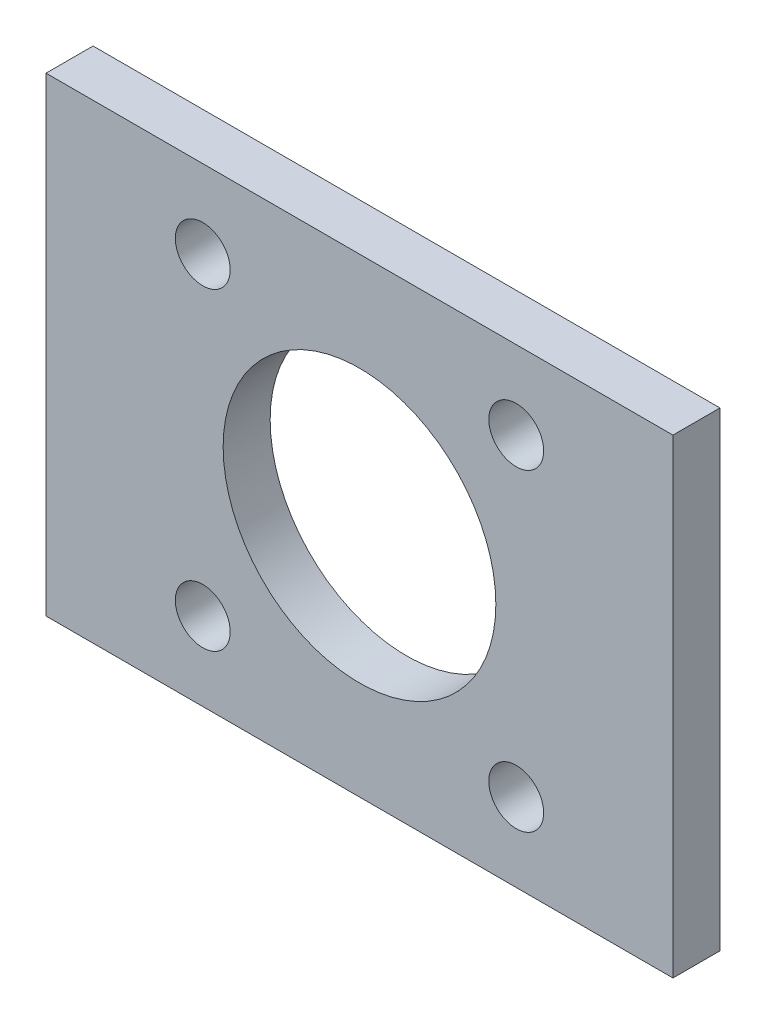
ISO-10303-21;
HEADER;
FILE_DESCRIPTION(('STEP AP214'),'2;1');
FILE_NAME('part.step','',(''),(''),'','','');
FILE_SCHEMA(('AUTOMOTIVE_DESIGN { 1 0 10303 214 1 1 1 1 }'));
ENDSEC;
DATA;
#1=APPLICATION_CONTEXT('core data for automotive mechanical design processes');
#2=APPLICATION_PROTOCOL_DEFINITION('international standard','automotive_design',2000,#1);
#3=PRODUCT_CONTEXT('',#1,'mechanical');
#4=PRODUCT('Part','Part','',(#3));
#5=PRODUCT_RELATED_PRODUCT_CATEGORY('part','',(#4));
#6=PRODUCT_DEFINITION_FORMATION('','',#4);
#7=PRODUCT_DEFINITION_CONTEXT('part definition',#1,'design');
#8=PRODUCT_DEFINITION('design','',#6,#7);
#9=PRODUCT_DEFINITION_SHAPE('','',#8);
#10=(LENGTH_UNIT() NAMED_UNIT(*) SI_UNIT(.MILLI.,.METRE.));
#11=(NAMED_UNIT(*) PLANE_ANGLE_UNIT() SI_UNIT($,.RADIAN.));
#12=(NAMED_UNIT(*) SI_UNIT($,.STERADIAN.) SOLID_ANGLE_UNIT());
#13=UNCERTAINTY_MEASURE_WITH_UNIT(LENGTH_MEASURE(1.E-05),#10,'distance_accuracy_value','');
#14=(GEOMETRIC_REPRESENTATION_CONTEXT(3) GLOBAL_UNCERTAINTY_ASSIGNED_CONTEXT((#13)) GLOBAL_UNIT_ASSIGNED_CONTEXT((#10,
#11,#12)) REPRESENTATION_CONTEXT('',''));
#15=CARTESIAN_POINT('',(0.,0.,0.));
#16=DIRECTION('',(0.,0.,1.));
#17=DIRECTION('',(1.,0.,0.));
#18=AXIS2_PLACEMENT_3D('',#15,#16,#17);
#19=CARTESIAN_POINT('',(46.5399833355393,-4.45065110459608,15.7508262269223));
#20=DIRECTION('',(0.,0.,1.));
#21=DIRECTION('',(1.,0.,0.));
#22=AXIS2_PLACEMENT_3D('',#19,#20,#21);
#23=PLANE('',#22);
#24=DIRECTION('',(0.,-1.,0.));
#25=VECTOR('',#24,1.);
#26=CARTESIAN_POINT('',(26.5399833355393,-14.4506511045961,15.7508262269223));
#27=LINE('',#26,#25);
#28=CARTESIAN_POINT('',(26.5399833355393,10.5493488954039,15.7508262269223));
#29=VERTEX_POINT('',#28);
#30=CARTESIAN_POINT('',(26.5399833355393,-19.4506511045961,15.7508262269223));
#31=VERTEX_POINT('',#30);
#32=EDGE_CURVE('E75',#29,#31,#27,.T.);
#33=ORIENTED_EDGE('',*,*,#32,.T.);
#34=DIRECTION('',(1.,0.,0.));
#35=VECTOR('',#34,1.);
#36=CARTESIAN_POINT('',(16.5399833355393,-19.4506511045961,15.7508262269223));
#37=LINE('',#36,#35);
#38=CARTESIAN_POINT('',(66.5399833355393,-19.4506511045961,15.7508262269223));
#39=VERTEX_POINT('',#38);
#40=EDGE_CURVE('E79',#31,#39,#37,.T.);
#41=ORIENTED_EDGE('',*,*,#40,.T.);
#42=DIRECTION('',(0.,1.,0.));
#43=VECTOR('',#42,1.);
#44=CARTESIAN_POINT('',(66.5399833355393,10.5493488954039,15.7508262269223));
#45=LINE('',#44,#43);
#46=CARTESIAN_POINT('',(66.5399833355393,10.5493488954039,15.7508262269223));
#47=VERTEX_POINT('',#46);
#48=EDGE_CURVE('E93',#39,#47,#45,.T.);
#49=ORIENTED_EDGE('',*,*,#48,.T.);
#50=DIRECTION('',(-1.,0.,0.));
#51=VECTOR('',#50,1.);
#52=CARTESIAN_POINT('',(26.5399833355393,10.5493488954039,15.7508262269223));
#53=LINE('',#52,#51);
#54=EDGE_CURVE('E58',#47,#29,#53,.T.);
#55=ORIENTED_EDGE('',*,*,#54,.T.);
#56=EDGE_LOOP('',(#33,#41,#49,#55));
#57=FACE_BOUND('',#56,.T.);
#58=CARTESIAN_POINT('',(36.5399833355393,-14.4506511045961,15.7508262269223));
#59=DIRECTION('',(0.,0.,1.));
#60=DIRECTION('',(1.,0.,0.));
#61=AXIS2_PLACEMENT_3D('',#58,#59,#60);
#62=CIRCLE('',#61,1.75);
#63=CARTESIAN_POINT('',(38.2899833355393,-14.4506511045961,15.7508262269223));
#64=VERTEX_POINT('',#63);
#65=EDGE_CURVE('E135',#64,#64,#62,.T.);
#66=ORIENTED_EDGE('',*,*,#65,.F.);
#67=EDGE_LOOP('',(#66));
#68=FACE_BOUND('',#67,.T.);
#69=CARTESIAN_POINT('',(56.5399833355393,5.54934889540392,15.7508262269223));
#70=DIRECTION('',(0.,0.,1.));
#71=DIRECTION('',(1.,0.,0.));
#72=AXIS2_PLACEMENT_3D('',#69,#70,#71);
#73=CIRCLE('',#72,1.75);
#74=CARTESIAN_POINT('',(58.2899833355393,5.54934889540392,15.7508262269223));
#75=VERTEX_POINT('',#74);
#76=EDGE_CURVE('E94',#75,#75,#73,.T.);
#77=ORIENTED_EDGE('',*,*,#76,.F.);
#78=EDGE_LOOP('',(#77));
#79=FACE_BOUND('',#78,.T.);
#80=CARTESIAN_POINT('',(36.5399833355393,5.54934889540389,15.7508262269223));
#81=DIRECTION('',(0.,0.,1.));
#82=DIRECTION('',(1.,0.,0.));
#83=AXIS2_PLACEMENT_3D('',#80,#81,#82);
#84=CIRCLE('',#83,1.74999999999999);
#85=CARTESIAN_POINT('',(38.2899833355393,5.54934889540389,15.7508262269223));
#86=VERTEX_POINT('',#85);
#87=EDGE_CURVE('E98',#86,#86,#84,.T.);
#88=ORIENTED_EDGE('',*,*,#87,.F.);
#89=EDGE_LOOP('',(#88));
#90=FACE_BOUND('',#89,.T.);
#91=CARTESIAN_POINT('',(56.5399833355393,-14.4506511045961,15.7508262269223));
#92=DIRECTION('',(0.,0.,1.));
#93=DIRECTION('',(1.,0.,0.));
#94=AXIS2_PLACEMENT_3D('',#91,#92,#93);
#95=CIRCLE('',#94,1.75);
#96=CARTESIAN_POINT('',(58.2899833355393,-14.4506511045961,15.7508262269223));
#97=VERTEX_POINT('',#96);
#98=EDGE_CURVE('E132',#97,#97,#95,.T.);
#99=ORIENTED_EDGE('',*,*,#98,.F.);
#100=EDGE_LOOP('',(#99));
#101=FACE_BOUND('',#100,.T.);
#102=CARTESIAN_POINT('',(46.5399833355393,-4.45065110459608,15.7508262269223));
#103=DIRECTION('',(0.,0.,1.));
#104=DIRECTION('',(1.,0.,0.));
#105=AXIS2_PLACEMENT_3D('',#102,#103,#104);
#106=CIRCLE('',#105,8.7);
#107=CARTESIAN_POINT('',(55.2399833355393,-4.45065110459608,15.7508262269223));
#108=VERTEX_POINT('',#107);
#109=EDGE_CURVE('E126',#108,#108,#106,.T.);
#110=ORIENTED_EDGE('',*,*,#109,.F.);
#111=EDGE_LOOP('',(#110));
#112=FACE_BOUND('',#111,.T.);
#113=ADVANCED_FACE('F35',(#57,#68,#79,#90,#101,#112),#23,.T.);
#114=CARTESIAN_POINT('',(16.5399833355393,-19.4506511045961,15.7508262269223));
#115=DIRECTION('',(0.,1.,0.));
#116=DIRECTION('',(0.,0.,1.));
#117=AXIS2_PLACEMENT_3D('',#114,#115,#116);
#118=PLANE('',#117);
#119=ORIENTED_EDGE('',*,*,#40,.F.);
#120=DIRECTION('',(0.,0.,-1.));
#121=VECTOR('',#120,1.);
#122=CARTESIAN_POINT('',(26.5399833355393,-19.4506511045961,15.7508262269223));
#123=LINE('',#122,#121);
#124=CARTESIAN_POINT('',(26.5399833355393,-19.4506511045961,12.7508262269223));
#125=VERTEX_POINT('',#124);
#126=EDGE_CURVE('E85',#31,#125,#123,.T.);
#127=ORIENTED_EDGE('',*,*,#126,.T.);
#128=DIRECTION('',(-1.,0.,0.));
#129=VECTOR('',#128,1.);
#130=CARTESIAN_POINT('',(76.5399833355393,-19.4506511045961,12.7508262269223));
#131=LINE('',#130,#129);
#132=CARTESIAN_POINT('',(66.5399833355393,-19.4506511045961,12.7508262269223));
#133=VERTEX_POINT('',#132);
#134=EDGE_CURVE('E108',#133,#125,#131,.T.);
#135=ORIENTED_EDGE('',*,*,#134,.F.);
#136=DIRECTION('',(0.,0.,-1.));
#137=VECTOR('',#136,1.);
#138=CARTESIAN_POINT('',(66.5399833355393,-19.4506511045961,15.7508262269223));
#139=LINE('',#138,#137);
#140=EDGE_CURVE('E90',#39,#133,#139,.T.);
#141=ORIENTED_EDGE('',*,*,#140,.F.);
#142=EDGE_LOOP('',(#119,#127,#135,#141));
#143=FACE_BOUND('',#142,.T.);
#144=ADVANCED_FACE('F37',(#143),#118,.F.);
#145=CARTESIAN_POINT('',(66.5399833355393,10.5493488954039,15.7508262269223));
#146=DIRECTION('',(-1.,0.,0.));
#147=DIRECTION('',(0.,-1.,0.));
#148=AXIS2_PLACEMENT_3D('',#145,#146,#147);
#149=PLANE('',#148);
#150=ORIENTED_EDGE('',*,*,#48,.F.);
#151=ORIENTED_EDGE('',*,*,#140,.T.);
#152=DIRECTION('',(0.,1.,0.));
#153=VECTOR('',#152,1.);
#154=CARTESIAN_POINT('',(66.5399833355393,10.5493488954039,12.7508262269223));
#155=LINE('',#154,#153);
#156=CARTESIAN_POINT('',(66.5399833355393,10.5493488954039,12.7508262269223));
#157=VERTEX_POINT('',#156);
#158=EDGE_CURVE('E50',#133,#157,#155,.T.);
#159=ORIENTED_EDGE('',*,*,#158,.T.);
#160=DIRECTION('',(0.,0.,-1.));
#161=VECTOR('',#160,1.);
#162=CARTESIAN_POINT('',(66.5399833355393,10.5493488954039,15.7508262269223));
#163=LINE('',#162,#161);
#164=EDGE_CURVE('E12',#47,#157,#163,.T.);
#165=ORIENTED_EDGE('',*,*,#164,.F.);
#166=EDGE_LOOP('',(#150,#151,#159,#165));
#167=FACE_BOUND('',#166,.T.);
#168=ADVANCED_FACE('F178',(#167),#149,.F.);
#169=CARTESIAN_POINT('',(26.5399833355393,10.5493488954039,15.7508262269223));
#170=DIRECTION('',(0.,-1.,0.));
#171=DIRECTION('',(1.,0.,0.));
#172=AXIS2_PLACEMENT_3D('',#169,#170,#171);
#173=PLANE('',#172);
#174=ORIENTED_EDGE('',*,*,#164,.T.);
#175=DIRECTION('',(1.,0.,0.));
#176=VECTOR('',#175,1.);
#177=CARTESIAN_POINT('',(76.5399833355393,10.5493488954039,12.7508262269223));
#178=LINE('',#177,#176);
#179=CARTESIAN_POINT('',(26.5399833355393,10.5493488954039,12.7508262269223));
#180=VERTEX_POINT('',#179);
#181=EDGE_CURVE('E105',#180,#157,#178,.T.);
#182=ORIENTED_EDGE('',*,*,#181,.F.);
#183=DIRECTION('',(0.,0.,-1.));
#184=VECTOR('',#183,1.);
#185=CARTESIAN_POINT('',(26.5399833355393,10.5493488954039,15.7508262269223));
#186=LINE('',#185,#184);
#187=EDGE_CURVE('E43',#29,#180,#186,.T.);
#188=ORIENTED_EDGE('',*,*,#187,.F.);
#189=ORIENTED_EDGE('',*,*,#54,.F.);
#190=EDGE_LOOP('',(#174,#182,#188,#189));
#191=FACE_BOUND('',#190,.T.);
#192=ADVANCED_FACE('F104',(#191),#173,.F.);
#193=CARTESIAN_POINT('',(26.5399833355393,-14.4506511045961,15.7508262269223));
#194=DIRECTION('',(1.,0.,0.));
#195=DIRECTION('',(0.,1.,0.));
#196=AXIS2_PLACEMENT_3D('',#193,#194,#195);
#197=PLANE('',#196);
#198=ORIENTED_EDGE('',*,*,#187,.T.);
#199=DIRECTION('',(0.,-1.,0.));
#200=VECTOR('',#199,1.);
#201=CARTESIAN_POINT('',(26.5399833355393,-14.4506511045961,12.7508262269223));
#202=LINE('',#201,#200);
#203=EDGE_CURVE('E87',#180,#125,#202,.T.);
#204=ORIENTED_EDGE('',*,*,#203,.T.);
#205=ORIENTED_EDGE('',*,*,#126,.F.);
#206=ORIENTED_EDGE('',*,*,#32,.F.);
#207=EDGE_LOOP('',(#198,#204,#205,#206));
#208=FACE_BOUND('',#207,.T.);
#209=ADVANCED_FACE('F86',(#208),#197,.F.);
#210=CARTESIAN_POINT('',(56.5399833355393,5.54934889540392,15.7508262269223));
#211=DIRECTION('',(0.,0.,-1.));
#212=DIRECTION('',(-1.,0.,0.));
#213=AXIS2_PLACEMENT_3D('',#210,#211,#212);
#214=CYLINDRICAL_SURFACE('',#213,1.75);
#215=CARTESIAN_POINT('',(56.5399833355393,5.54934889540392,12.7508262269223));
#216=DIRECTION('',(0.,0.,1.));
#217=DIRECTION('',(1.,0.,0.));
#218=AXIS2_PLACEMENT_3D('',#215,#216,#217);
#219=CIRCLE('',#218,1.75);
#220=CARTESIAN_POINT('',(58.2899833355393,5.54934889540392,12.7508262269223));
#221=VERTEX_POINT('',#220);
#222=EDGE_CURVE('E121',#221,#221,#219,.T.);
#223=ORIENTED_EDGE('',*,*,#222,.F.);
#224=EDGE_LOOP('',(#223));
#225=FACE_BOUND('',#224,.T.);
#226=ORIENTED_EDGE('',*,*,#76,.T.);
#227=EDGE_LOOP('',(#226));
#228=FACE_BOUND('',#227,.T.);
#229=ADVANCED_FACE('F170',(#225,#228),#214,.F.);
#230=CARTESIAN_POINT('',(36.5399833355393,5.54934889540389,15.7508262269223));
#231=DIRECTION('',(0.,0.,-1.));
#232=DIRECTION('',(-1.,0.,0.));
#233=AXIS2_PLACEMENT_3D('',#230,#231,#232);
#234=CYLINDRICAL_SURFACE('',#233,1.74999999999999);
#235=CARTESIAN_POINT('',(36.5399833355393,5.54934889540389,12.7508262269223));
#236=DIRECTION('',(0.,0.,1.));
#237=DIRECTION('',(1.,0.,0.));
#238=AXIS2_PLACEMENT_3D('',#235,#236,#237);
#239=CIRCLE('',#238,1.74999999999999);
#240=CARTESIAN_POINT('',(38.2899833355393,5.54934889540389,12.7508262269223));
#241=VERTEX_POINT('',#240);
#242=EDGE_CURVE('E118',#241,#241,#239,.T.);
#243=ORIENTED_EDGE('',*,*,#242,.F.);
#244=EDGE_LOOP('',(#243));
#245=FACE_BOUND('',#244,.T.);
#246=ORIENTED_EDGE('',*,*,#87,.T.);
#247=EDGE_LOOP('',(#246));
#248=FACE_BOUND('',#247,.T.);
#249=ADVANCED_FACE('F140',(#245,#248),#234,.F.);
#250=CARTESIAN_POINT('',(36.5399833355393,-14.4506511045961,15.7508262269223));
#251=DIRECTION('',(0.,0.,-1.));
#252=DIRECTION('',(-1.,0.,0.));
#253=AXIS2_PLACEMENT_3D('',#250,#251,#252);
#254=CYLINDRICAL_SURFACE('',#253,1.75);
#255=CARTESIAN_POINT('',(36.5399833355393,-14.4506511045961,12.7508262269223));
#256=DIRECTION('',(0.,0.,1.));
#257=DIRECTION('',(1.,0.,0.));
#258=AXIS2_PLACEMENT_3D('',#255,#256,#257);
#259=CIRCLE('',#258,1.75);
#260=CARTESIAN_POINT('',(38.2899833355393,-14.4506511045961,12.7508262269223));
#261=VERTEX_POINT('',#260);
#262=EDGE_CURVE('E111',#261,#261,#259,.T.);
#263=ORIENTED_EDGE('',*,*,#262,.F.);
#264=EDGE_LOOP('',(#263));
#265=FACE_BOUND('',#264,.T.);
#266=ORIENTED_EDGE('',*,*,#65,.T.);
#267=EDGE_LOOP('',(#266));
#268=FACE_BOUND('',#267,.T.);
#269=ADVANCED_FACE('F161',(#265,#268),#254,.F.);
#270=CARTESIAN_POINT('',(56.5399833355393,-14.4506511045961,15.7508262269223));
#271=DIRECTION('',(0.,0.,-1.));
#272=DIRECTION('',(-1.,0.,0.));
#273=AXIS2_PLACEMENT_3D('',#270,#271,#272);
#274=CYLINDRICAL_SURFACE('',#273,1.75);
#275=CARTESIAN_POINT('',(56.5399833355393,-14.4506511045961,12.7508262269223));
#276=DIRECTION('',(0.,0.,1.));
#277=DIRECTION('',(1.,0.,0.));
#278=AXIS2_PLACEMENT_3D('',#275,#276,#277);
#279=CIRCLE('',#278,1.75);
#280=CARTESIAN_POINT('',(58.2899833355393,-14.4506511045961,12.7508262269223));
#281=VERTEX_POINT('',#280);
#282=EDGE_CURVE('E107',#281,#281,#279,.T.);
#283=ORIENTED_EDGE('',*,*,#282,.F.);
#284=EDGE_LOOP('',(#283));
#285=FACE_BOUND('',#284,.T.);
#286=ORIENTED_EDGE('',*,*,#98,.T.);
#287=EDGE_LOOP('',(#286));
#288=FACE_BOUND('',#287,.T.);
#289=ADVANCED_FACE('F152',(#285,#288),#274,.F.);
#290=CARTESIAN_POINT('',(46.5399833355393,-4.45065110459608,-21.6849168831158));
#291=DIRECTION('',(0.,0.,1.));
#292=DIRECTION('',(1.,0.,0.));
#293=AXIS2_PLACEMENT_3D('',#290,#291,#292);
#294=CYLINDRICAL_SURFACE('',#293,8.7);
#295=CARTESIAN_POINT('',(46.5399833355393,-4.45065110459608,12.7508262269223));
#296=DIRECTION('',(0.,0.,1.));
#297=DIRECTION('',(1.,0.,0.));
#298=AXIS2_PLACEMENT_3D('',#295,#296,#297);
#299=CIRCLE('',#298,8.7);
#300=CARTESIAN_POINT('',(55.2399833355393,-4.45065110459608,12.7508262269223));
#301=VERTEX_POINT('',#300);
#302=EDGE_CURVE('E129',#301,#301,#299,.F.);
#303=ORIENTED_EDGE('',*,*,#302,.T.);
#304=EDGE_LOOP('',(#303));
#305=FACE_BOUND('',#304,.T.);
#306=ORIENTED_EDGE('',*,*,#109,.T.);
#307=EDGE_LOOP('',(#306));
#308=FACE_BOUND('',#307,.T.);
#309=ADVANCED_FACE('F149',(#305,#308),#294,.F.);
#310=CARTESIAN_POINT('',(46.5399833355393,-4.45065110459608,12.7508262269223));
#311=DIRECTION('',(0.,0.,1.));
#312=DIRECTION('',(1.,0.,0.));
#313=AXIS2_PLACEMENT_3D('',#310,#311,#312);
#314=PLANE('',#313);
#315=ORIENTED_EDGE('',*,*,#302,.F.);
#316=EDGE_LOOP('',(#315));
#317=FACE_BOUND('',#316,.T.);
#318=ORIENTED_EDGE('',*,*,#222,.T.);
#319=EDGE_LOOP('',(#318));
#320=FACE_BOUND('',#319,.T.);
#321=ORIENTED_EDGE('',*,*,#242,.T.);
#322=EDGE_LOOP('',(#321));
#323=FACE_BOUND('',#322,.T.);
#324=ORIENTED_EDGE('',*,*,#262,.T.);
#325=EDGE_LOOP('',(#324));
#326=FACE_BOUND('',#325,.T.);
#327=ORIENTED_EDGE('',*,*,#282,.T.);
#328=EDGE_LOOP('',(#327));
#329=FACE_BOUND('',#328,.T.);
#330=ORIENTED_EDGE('',*,*,#134,.T.);
#331=ORIENTED_EDGE('',*,*,#203,.F.);
#332=ORIENTED_EDGE('',*,*,#181,.T.);
#333=ORIENTED_EDGE('',*,*,#158,.F.);
#334=EDGE_LOOP('',(#330,#331,#332,#333));
#335=FACE_BOUND('',#334,.T.);
#336=ADVANCED_FACE('F151',(#317,#320,#323,#326,#329,#335),#314,.F.);
#337=CLOSED_SHELL('',(#113,#144,#168,#192,#209,#229,#249,#269,#289,#309,#336));
#338=MANIFOLD_SOLID_BREP('B2',#337);
#339=ADVANCED_BREP_SHAPE_REPRESENTATION('',(#18,#338),#14);
#340=SHAPE_DEFINITION_REPRESENTATION(#9,#339);
ENDSEC;
END-ISO-10303-21;
